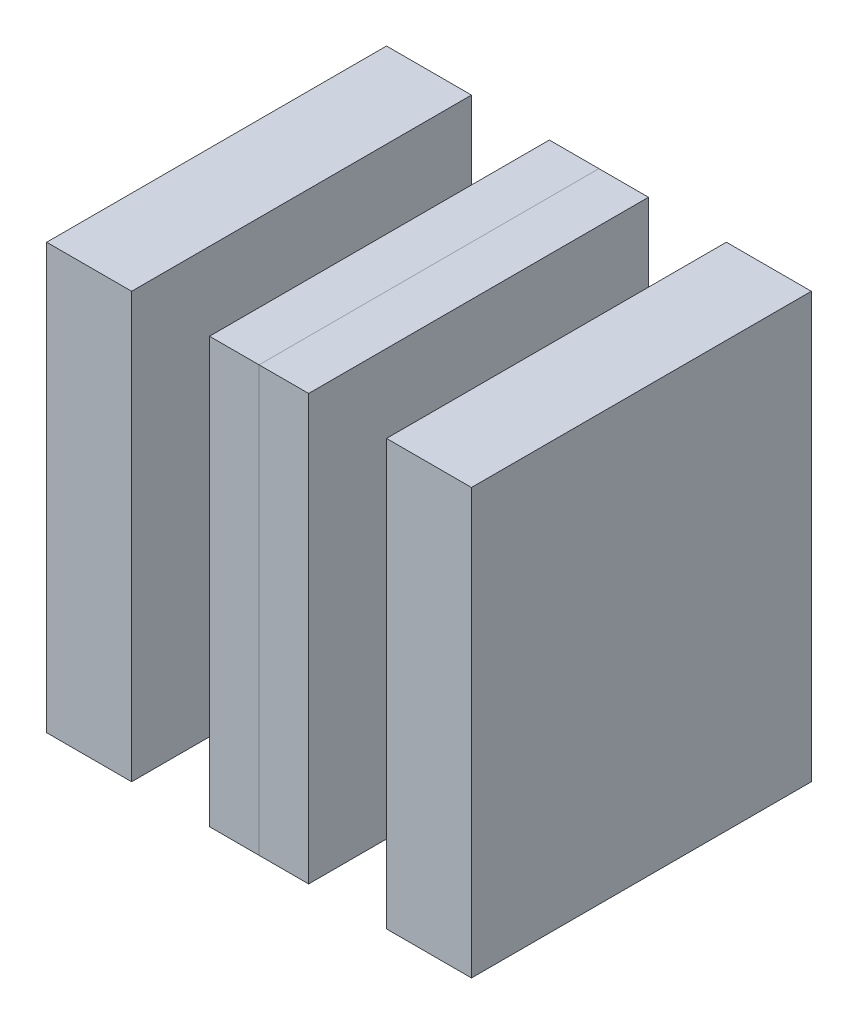
ISO-10303-21;
HEADER;
FILE_DESCRIPTION(('STEP AP214'),'2;1');
FILE_NAME('part.step','',(''),(''),'','','');
FILE_SCHEMA(('AUTOMOTIVE_DESIGN { 1 0 10303 214 1 1 1 1 }'));
ENDSEC;
DATA;
#1=APPLICATION_CONTEXT('core data for automotive mechanical design processes');
#2=APPLICATION_PROTOCOL_DEFINITION('international standard','automotive_design',2000,#1);
#3=PRODUCT_CONTEXT('',#1,'mechanical');
#4=PRODUCT('Part','Part','',(#3));
#5=PRODUCT_RELATED_PRODUCT_CATEGORY('part','',(#4));
#6=PRODUCT_DEFINITION_FORMATION('','',#4);
#7=PRODUCT_DEFINITION_CONTEXT('part definition',#1,'design');
#8=PRODUCT_DEFINITION('design','',#6,#7);
#9=PRODUCT_DEFINITION_SHAPE('','',#8);
#10=(LENGTH_UNIT() NAMED_UNIT(*) SI_UNIT(.MILLI.,.METRE.));
#11=(NAMED_UNIT(*) PLANE_ANGLE_UNIT() SI_UNIT($,.RADIAN.));
#12=(NAMED_UNIT(*) SI_UNIT($,.STERADIAN.) SOLID_ANGLE_UNIT());
#13=UNCERTAINTY_MEASURE_WITH_UNIT(LENGTH_MEASURE(1.E-05),#10,'distance_accuracy_value','');
#14=(GEOMETRIC_REPRESENTATION_CONTEXT(3) GLOBAL_UNCERTAINTY_ASSIGNED_CONTEXT((#13)) GLOBAL_UNIT_ASSIGNED_CONTEXT((#10,
#11,#12)) REPRESENTATION_CONTEXT('',''));
#15=CARTESIAN_POINT('',(0.,0.,0.));
#16=DIRECTION('',(0.,0.,1.));
#17=DIRECTION('',(1.,0.,0.));
#18=AXIS2_PLACEMENT_3D('',#15,#16,#17);
#19=CARTESIAN_POINT('',(15.,0.,12.));
#20=DIRECTION('',(-1.,0.,0.));
#21=DIRECTION('',(0.,0.,-1.));
#22=AXIS2_PLACEMENT_3D('',#19,#20,#21);
#23=PLANE('',#22);
#24=DIRECTION('',(0.,-1.,0.));
#25=VECTOR('',#24,1.);
#26=CARTESIAN_POINT('',(15.,0.,0.));
#27=LINE('',#26,#25);
#28=CARTESIAN_POINT('',(15.,15.,0.));
#29=VERTEX_POINT('',#28);
#30=CARTESIAN_POINT('',(15.,0.,0.));
#31=VERTEX_POINT('',#30);
#32=EDGE_CURVE('E106',#29,#31,#27,.T.);
#33=ORIENTED_EDGE('',*,*,#32,.F.);
#34=DIRECTION('',(0.,0.,-1.));
#35=VECTOR('',#34,1.);
#36=CARTESIAN_POINT('',(15.,15.,12.));
#37=LINE('',#36,#35);
#38=CARTESIAN_POINT('',(15.,15.,12.));
#39=VERTEX_POINT('',#38);
#40=EDGE_CURVE('E105',#39,#29,#37,.T.);
#41=ORIENTED_EDGE('',*,*,#40,.F.);
#42=DIRECTION('',(0.,-1.,0.));
#43=VECTOR('',#42,1.);
#44=CARTESIAN_POINT('',(15.,0.,12.));
#45=LINE('',#44,#43);
#46=CARTESIAN_POINT('',(15.,0.,12.));
#47=VERTEX_POINT('',#46);
#48=EDGE_CURVE('E100',#39,#47,#45,.T.);
#49=ORIENTED_EDGE('',*,*,#48,.T.);
#50=DIRECTION('',(0.,0.,-1.));
#51=VECTOR('',#50,1.);
#52=CARTESIAN_POINT('',(15.,0.,12.));
#53=LINE('',#52,#51);
#54=EDGE_CURVE('E12',#47,#31,#53,.T.);
#55=ORIENTED_EDGE('',*,*,#54,.T.);
#56=EDGE_LOOP('',(#33,#41,#49,#55));
#57=FACE_BOUND('',#56,.T.);
#58=ADVANCED_FACE('F43',(#57),#23,.F.);
#59=CARTESIAN_POINT('',(15.,0.,12.));
#60=DIRECTION('',(0.,1.,0.));
#61=DIRECTION('',(0.,0.,1.));
#62=AXIS2_PLACEMENT_3D('',#59,#60,#61);
#63=PLANE('',#62);
#64=DIRECTION('',(-1.,0.,0.));
#65=VECTOR('',#64,1.);
#66=CARTESIAN_POINT('',(15.,0.,0.));
#67=LINE('',#66,#65);
#68=CARTESIAN_POINT('',(12.,0.,0.));
#69=VERTEX_POINT('',#68);
#70=EDGE_CURVE('E108',#31,#69,#67,.T.);
#71=ORIENTED_EDGE('',*,*,#70,.F.);
#72=ORIENTED_EDGE('',*,*,#54,.F.);
#73=DIRECTION('',(-1.,0.,0.));
#74=VECTOR('',#73,1.);
#75=CARTESIAN_POINT('',(15.,0.,12.));
#76=LINE('',#75,#74);
#77=CARTESIAN_POINT('',(12.,0.,12.));
#78=VERTEX_POINT('',#77);
#79=EDGE_CURVE('E84',#47,#78,#76,.T.);
#80=ORIENTED_EDGE('',*,*,#79,.T.);
#81=DIRECTION('',(0.,0.,-1.));
#82=VECTOR('',#81,1.);
#83=CARTESIAN_POINT('',(12.,0.,12.));
#84=LINE('',#83,#82);
#85=EDGE_CURVE('E51',#78,#69,#84,.T.);
#86=ORIENTED_EDGE('',*,*,#85,.T.);
#87=EDGE_LOOP('',(#71,#72,#80,#86));
#88=FACE_BOUND('',#87,.T.);
#89=ADVANCED_FACE('F98',(#88),#63,.F.);
#90=CARTESIAN_POINT('',(12.,0.,12.));
#91=DIRECTION('',(1.,0.,0.));
#92=DIRECTION('',(0.,0.,1.));
#93=AXIS2_PLACEMENT_3D('',#90,#91,#92);
#94=PLANE('',#93);
#95=DIRECTION('',(0.,1.,0.));
#96=VECTOR('',#95,1.);
#97=CARTESIAN_POINT('',(12.,0.,0.));
#98=LINE('',#97,#96);
#99=CARTESIAN_POINT('',(12.,15.,0.));
#100=VERTEX_POINT('',#99);
#101=EDGE_CURVE('E94',#69,#100,#98,.T.);
#102=ORIENTED_EDGE('',*,*,#101,.F.);
#103=ORIENTED_EDGE('',*,*,#85,.F.);
#104=DIRECTION('',(0.,1.,0.));
#105=VECTOR('',#104,1.);
#106=CARTESIAN_POINT('',(12.,0.,12.));
#107=LINE('',#106,#105);
#108=CARTESIAN_POINT('',(12.,15.,12.));
#109=VERTEX_POINT('',#108);
#110=EDGE_CURVE('E87',#78,#109,#107,.T.);
#111=ORIENTED_EDGE('',*,*,#110,.T.);
#112=DIRECTION('',(0.,0.,-1.));
#113=VECTOR('',#112,1.);
#114=CARTESIAN_POINT('',(12.,15.,12.));
#115=LINE('',#114,#113);
#116=EDGE_CURVE('E97',#109,#100,#115,.T.);
#117=ORIENTED_EDGE('',*,*,#116,.T.);
#118=EDGE_LOOP('',(#102,#103,#111,#117));
#119=FACE_BOUND('',#118,.T.);
#120=ADVANCED_FACE('F93',(#119),#94,.F.);
#121=CARTESIAN_POINT('',(15.,15.,12.));
#122=DIRECTION('',(0.,-1.,0.));
#123=DIRECTION('',(0.,0.,-1.));
#124=AXIS2_PLACEMENT_3D('',#121,#122,#123);
#125=PLANE('',#124);
#126=DIRECTION('',(1.,0.,0.));
#127=VECTOR('',#126,1.);
#128=CARTESIAN_POINT('',(15.,15.,0.));
#129=LINE('',#128,#127);
#130=EDGE_CURVE('E73',#100,#29,#129,.T.);
#131=ORIENTED_EDGE('',*,*,#130,.F.);
#132=ORIENTED_EDGE('',*,*,#116,.F.);
#133=DIRECTION('',(1.,0.,0.));
#134=VECTOR('',#133,1.);
#135=CARTESIAN_POINT('',(15.,15.,12.));
#136=LINE('',#135,#134);
#137=EDGE_CURVE('E59',#109,#39,#136,.T.);
#138=ORIENTED_EDGE('',*,*,#137,.T.);
#139=ORIENTED_EDGE('',*,*,#40,.T.);
#140=EDGE_LOOP('',(#131,#132,#138,#139));
#141=FACE_BOUND('',#140,.T.);
#142=ADVANCED_FACE('F117',(#141),#125,.F.);
#143=CARTESIAN_POINT('',(15.,0.,12.));
#144=DIRECTION('',(0.,0.,-1.));
#145=DIRECTION('',(1.,0.,0.));
#146=AXIS2_PLACEMENT_3D('',#143,#144,#145);
#147=PLANE('',#146);
#148=ORIENTED_EDGE('',*,*,#48,.F.);
#149=ORIENTED_EDGE('',*,*,#137,.F.);
#150=ORIENTED_EDGE('',*,*,#110,.F.);
#151=ORIENTED_EDGE('',*,*,#79,.F.);
#152=EDGE_LOOP('',(#148,#149,#150,#151));
#153=FACE_BOUND('',#152,.T.);
#154=ADVANCED_FACE('F89',(#153),#147,.F.);
#155=CARTESIAN_POINT('',(15.,0.,0.));
#156=DIRECTION('',(0.,0.,-1.));
#157=DIRECTION('',(1.,0.,0.));
#158=AXIS2_PLACEMENT_3D('',#155,#156,#157);
#159=PLANE('',#158);
#160=ORIENTED_EDGE('',*,*,#32,.T.);
#161=ORIENTED_EDGE('',*,*,#70,.T.);
#162=ORIENTED_EDGE('',*,*,#101,.T.);
#163=ORIENTED_EDGE('',*,*,#130,.T.);
#164=EDGE_LOOP('',(#160,#161,#162,#163));
#165=FACE_BOUND('',#164,.T.);
#166=ADVANCED_FACE('F113',(#165),#159,.T.);
#167=CLOSED_SHELL('',(#58,#89,#120,#142,#154,#166));
#168=MANIFOLD_SOLID_BREP('B2',#167);
#169=CARTESIAN_POINT('',(9.25,15.,12.));
#170=DIRECTION('',(-1.,0.,0.));
#171=DIRECTION('',(0.,1.,0.));
#172=AXIS2_PLACEMENT_3D('',#169,#170,#171);
#173=PLANE('',#172);
#174=DIRECTION('',(0.,-1.,0.));
#175=VECTOR('',#174,1.);
#176=CARTESIAN_POINT('',(9.25,15.,0.));
#177=LINE('',#176,#175);
#178=CARTESIAN_POINT('',(9.25,15.,0.));
#179=VERTEX_POINT('',#178);
#180=CARTESIAN_POINT('',(9.25,0.,0.));
#181=VERTEX_POINT('',#180);
#182=EDGE_CURVE('E239',#179,#181,#177,.T.);
#183=ORIENTED_EDGE('',*,*,#182,.F.);
#184=DIRECTION('',(0.,0.,-1.));
#185=VECTOR('',#184,1.);
#186=CARTESIAN_POINT('',(9.25,15.,12.));
#187=LINE('',#186,#185);
#188=CARTESIAN_POINT('',(9.25,15.,12.));
#189=VERTEX_POINT('',#188);
#190=EDGE_CURVE('E238',#189,#179,#187,.T.);
#191=ORIENTED_EDGE('',*,*,#190,.F.);
#192=DIRECTION('',(0.,-1.,0.));
#193=VECTOR('',#192,1.);
#194=CARTESIAN_POINT('',(9.25,15.,12.));
#195=LINE('',#194,#193);
#196=CARTESIAN_POINT('',(9.25,0.,12.));
#197=VERTEX_POINT('',#196);
#198=EDGE_CURVE('E233',#189,#197,#195,.T.);
#199=ORIENTED_EDGE('',*,*,#198,.T.);
#200=DIRECTION('',(0.,0.,-1.));
#201=VECTOR('',#200,1.);
#202=CARTESIAN_POINT('',(9.25,0.,12.));
#203=LINE('',#202,#201);
#204=EDGE_CURVE('E41',#197,#181,#203,.T.);
#205=ORIENTED_EDGE('',*,*,#204,.T.);
#206=EDGE_LOOP('',(#183,#191,#199,#205));
#207=FACE_BOUND('',#206,.T.);
#208=ADVANCED_FACE('F176',(#207),#173,.F.);
#209=CARTESIAN_POINT('',(9.25,0.,12.));
#210=DIRECTION('',(0.,1.,0.));
#211=DIRECTION('',(0.,0.,1.));
#212=AXIS2_PLACEMENT_3D('',#209,#210,#211);
#213=PLANE('',#212);
#214=DIRECTION('',(-1.,0.,0.));
#215=VECTOR('',#214,1.);
#216=CARTESIAN_POINT('',(9.25,0.,0.));
#217=LINE('',#216,#215);
#218=CARTESIAN_POINT('',(7.5,0.,0.));
#219=VERTEX_POINT('',#218);
#220=EDGE_CURVE('E241',#181,#219,#217,.T.);
#221=ORIENTED_EDGE('',*,*,#220,.F.);
#222=ORIENTED_EDGE('',*,*,#204,.F.);
#223=DIRECTION('',(-1.,0.,0.));
#224=VECTOR('',#223,1.);
#225=CARTESIAN_POINT('',(9.25,0.,12.));
#226=LINE('',#225,#224);
#227=CARTESIAN_POINT('',(7.5,0.,12.));
#228=VERTEX_POINT('',#227);
#229=EDGE_CURVE('E217',#197,#228,#226,.T.);
#230=ORIENTED_EDGE('',*,*,#229,.T.);
#231=DIRECTION('',(0.,0.,-1.));
#232=VECTOR('',#231,1.);
#233=CARTESIAN_POINT('',(7.5,0.,12.));
#234=LINE('',#233,#232);
#235=EDGE_CURVE('E184',#228,#219,#234,.T.);
#236=ORIENTED_EDGE('',*,*,#235,.T.);
#237=EDGE_LOOP('',(#221,#222,#230,#236));
#238=FACE_BOUND('',#237,.T.);
#239=ADVANCED_FACE('F231',(#238),#213,.F.);
#240=CARTESIAN_POINT('',(7.5,15.,12.));
#241=DIRECTION('',(1.,0.,0.));
#242=DIRECTION('',(0.,-1.,0.));
#243=AXIS2_PLACEMENT_3D('',#240,#241,#242);
#244=PLANE('',#243);
#245=DIRECTION('',(0.,1.,0.));
#246=VECTOR('',#245,1.);
#247=CARTESIAN_POINT('',(7.5,15.,0.));
#248=LINE('',#247,#246);
#249=CARTESIAN_POINT('',(7.5,15.,0.));
#250=VERTEX_POINT('',#249);
#251=EDGE_CURVE('E227',#219,#250,#248,.T.);
#252=ORIENTED_EDGE('',*,*,#251,.F.);
#253=ORIENTED_EDGE('',*,*,#235,.F.);
#254=DIRECTION('',(0.,1.,0.));
#255=VECTOR('',#254,1.);
#256=CARTESIAN_POINT('',(7.5,15.,12.));
#257=LINE('',#256,#255);
#258=CARTESIAN_POINT('',(7.5,15.,12.));
#259=VERTEX_POINT('',#258);
#260=EDGE_CURVE('E220',#228,#259,#257,.T.);
#261=ORIENTED_EDGE('',*,*,#260,.T.);
#262=DIRECTION('',(0.,0.,-1.));
#263=VECTOR('',#262,1.);
#264=CARTESIAN_POINT('',(7.5,15.,12.));
#265=LINE('',#264,#263);
#266=EDGE_CURVE('E230',#259,#250,#265,.T.);
#267=ORIENTED_EDGE('',*,*,#266,.T.);
#268=EDGE_LOOP('',(#252,#253,#261,#267));
#269=FACE_BOUND('',#268,.T.);
#270=ADVANCED_FACE('F226',(#269),#244,.F.);
#271=CARTESIAN_POINT('',(9.25,15.,12.));
#272=DIRECTION('',(0.,-1.,0.));
#273=DIRECTION('',(0.,0.,-1.));
#274=AXIS2_PLACEMENT_3D('',#271,#272,#273);
#275=PLANE('',#274);
#276=DIRECTION('',(1.,0.,0.));
#277=VECTOR('',#276,1.);
#278=CARTESIAN_POINT('',(9.25,15.,0.));
#279=LINE('',#278,#277);
#280=EDGE_CURVE('E206',#250,#179,#279,.T.);
#281=ORIENTED_EDGE('',*,*,#280,.F.);
#282=ORIENTED_EDGE('',*,*,#266,.F.);
#283=DIRECTION('',(1.,0.,0.));
#284=VECTOR('',#283,1.);
#285=CARTESIAN_POINT('',(9.25,15.,12.));
#286=LINE('',#285,#284);
#287=EDGE_CURVE('E192',#259,#189,#286,.T.);
#288=ORIENTED_EDGE('',*,*,#287,.T.);
#289=ORIENTED_EDGE('',*,*,#190,.T.);
#290=EDGE_LOOP('',(#281,#282,#288,#289));
#291=FACE_BOUND('',#290,.T.);
#292=ADVANCED_FACE('F250',(#291),#275,.F.);
#293=CARTESIAN_POINT('',(15.,0.,12.));
#294=DIRECTION('',(0.,0.,1.));
#295=DIRECTION('',(-1.,0.,0.));
#296=AXIS2_PLACEMENT_3D('',#293,#294,#295);
#297=PLANE('',#296);
#298=ORIENTED_EDGE('',*,*,#198,.F.);
#299=ORIENTED_EDGE('',*,*,#287,.F.);
#300=ORIENTED_EDGE('',*,*,#260,.F.);
#301=ORIENTED_EDGE('',*,*,#229,.F.);
#302=EDGE_LOOP('',(#298,#299,#300,#301));
#303=FACE_BOUND('',#302,.T.);
#304=ADVANCED_FACE('F222',(#303),#297,.T.);
#305=CARTESIAN_POINT('',(15.,0.,0.));
#306=DIRECTION('',(0.,0.,1.));
#307=DIRECTION('',(-1.,0.,0.));
#308=AXIS2_PLACEMENT_3D('',#305,#306,#307);
#309=PLANE('',#308);
#310=ORIENTED_EDGE('',*,*,#182,.T.);
#311=ORIENTED_EDGE('',*,*,#220,.T.);
#312=ORIENTED_EDGE('',*,*,#251,.T.);
#313=ORIENTED_EDGE('',*,*,#280,.T.);
#314=EDGE_LOOP('',(#310,#311,#312,#313));
#315=FACE_BOUND('',#314,.T.);
#316=ADVANCED_FACE('F246',(#315),#309,.F.);
#317=CLOSED_SHELL('',(#208,#239,#270,#292,#304,#316));
#318=MANIFOLD_SOLID_BREP('B6',#317);
#319=CARTESIAN_POINT('',(5.75,15.,12.));
#320=DIRECTION('',(1.,0.,0.));
#321=DIRECTION('',(0.,1.,0.));
#322=AXIS2_PLACEMENT_3D('',#319,#320,#321);
#323=PLANE('',#322);
#324=DIRECTION('',(0.,-1.,0.));
#325=VECTOR('',#324,1.);
#326=CARTESIAN_POINT('',(5.75,15.,0.));
#327=LINE('',#326,#325);
#328=CARTESIAN_POINT('',(5.75,15.,0.));
#329=VERTEX_POINT('',#328);
#330=CARTESIAN_POINT('',(5.75,0.,0.));
#331=VERTEX_POINT('',#330);
#332=EDGE_CURVE('E371',#329,#331,#327,.T.);
#333=ORIENTED_EDGE('',*,*,#332,.T.);
#334=DIRECTION('',(0.,0.,-1.));
#335=VECTOR('',#334,1.);
#336=CARTESIAN_POINT('',(5.75,0.,12.));
#337=LINE('',#336,#335);
#338=CARTESIAN_POINT('',(5.75,0.,12.));
#339=VERTEX_POINT('',#338);
#340=EDGE_CURVE('E174',#339,#331,#337,.T.);
#341=ORIENTED_EDGE('',*,*,#340,.F.);
#342=DIRECTION('',(0.,-1.,0.));
#343=VECTOR('',#342,1.);
#344=CARTESIAN_POINT('',(5.75,15.,12.));
#345=LINE('',#344,#343);
#346=CARTESIAN_POINT('',(5.75,15.,12.));
#347=VERTEX_POINT('',#346);
#348=EDGE_CURVE('E359',#347,#339,#345,.T.);
#349=ORIENTED_EDGE('',*,*,#348,.F.);
#350=DIRECTION('',(0.,0.,-1.));
#351=VECTOR('',#350,1.);
#352=CARTESIAN_POINT('',(5.75,15.,12.));
#353=LINE('',#352,#351);
#354=EDGE_CURVE('E367',#347,#329,#353,.T.);
#355=ORIENTED_EDGE('',*,*,#354,.T.);
#356=EDGE_LOOP('',(#333,#341,#349,#355));
#357=FACE_BOUND('',#356,.T.);
#358=ADVANCED_FACE('F308',(#357),#323,.F.);
#359=CARTESIAN_POINT('',(5.75,0.,12.));
#360=DIRECTION('',(0.,1.,0.));
#361=DIRECTION('',(0.,0.,1.));
#362=AXIS2_PLACEMENT_3D('',#359,#360,#361);
#363=PLANE('',#362);
#364=DIRECTION('',(1.,0.,0.));
#365=VECTOR('',#364,1.);
#366=CARTESIAN_POINT('',(5.75,0.,0.));
#367=LINE('',#366,#365);
#368=CARTESIAN_POINT('',(7.5,0.,0.));
#369=VERTEX_POINT('',#368);
#370=EDGE_CURVE('E363',#331,#369,#367,.T.);
#371=ORIENTED_EDGE('',*,*,#370,.T.);
#372=DIRECTION('',(0.,0.,-1.));
#373=VECTOR('',#372,1.);
#374=CARTESIAN_POINT('',(7.5,0.,12.));
#375=LINE('',#374,#373);
#376=CARTESIAN_POINT('',(7.5,0.,12.));
#377=VERTEX_POINT('',#376);
#378=EDGE_CURVE('E316',#377,#369,#375,.T.);
#379=ORIENTED_EDGE('',*,*,#378,.F.);
#380=DIRECTION('',(1.,0.,0.));
#381=VECTOR('',#380,1.);
#382=CARTESIAN_POINT('',(5.75,0.,12.));
#383=LINE('',#382,#381);
#384=EDGE_CURVE('E354',#339,#377,#383,.T.);
#385=ORIENTED_EDGE('',*,*,#384,.F.);
#386=ORIENTED_EDGE('',*,*,#340,.T.);
#387=EDGE_LOOP('',(#371,#379,#385,#386));
#388=FACE_BOUND('',#387,.T.);
#389=ADVANCED_FACE('F362',(#388),#363,.F.);
#390=CARTESIAN_POINT('',(7.5,15.,12.));
#391=DIRECTION('',(-1.,0.,0.));
#392=DIRECTION('',(0.,-1.,0.));
#393=AXIS2_PLACEMENT_3D('',#390,#391,#392);
#394=PLANE('',#393);
#395=DIRECTION('',(0.,1.,0.));
#396=VECTOR('',#395,1.);
#397=CARTESIAN_POINT('',(7.5,15.,0.));
#398=LINE('',#397,#396);
#399=CARTESIAN_POINT('',(7.5,15.,0.));
#400=VERTEX_POINT('',#399);
#401=EDGE_CURVE('E341',#369,#400,#398,.T.);
#402=ORIENTED_EDGE('',*,*,#401,.T.);
#403=DIRECTION('',(0.,0.,-1.));
#404=VECTOR('',#403,1.);
#405=CARTESIAN_POINT('',(7.5,15.,12.));
#406=LINE('',#405,#404);
#407=CARTESIAN_POINT('',(7.5,15.,12.));
#408=VERTEX_POINT('',#407);
#409=EDGE_CURVE('E364',#408,#400,#406,.T.);
#410=ORIENTED_EDGE('',*,*,#409,.F.);
#411=DIRECTION('',(0.,1.,0.));
#412=VECTOR('',#411,1.);
#413=CARTESIAN_POINT('',(7.5,15.,12.));
#414=LINE('',#413,#412);
#415=EDGE_CURVE('E357',#377,#408,#414,.T.);
#416=ORIENTED_EDGE('',*,*,#415,.F.);
#417=ORIENTED_EDGE('',*,*,#378,.T.);
#418=EDGE_LOOP('',(#402,#410,#416,#417));
#419=FACE_BOUND('',#418,.T.);
#420=ADVANCED_FACE('F365',(#419),#394,.F.);
#421=CARTESIAN_POINT('',(5.75,15.,12.));
#422=DIRECTION('',(0.,-1.,0.));
#423=DIRECTION('',(0.,0.,-1.));
#424=AXIS2_PLACEMENT_3D('',#421,#422,#423);
#425=PLANE('',#424);
#426=DIRECTION('',(-1.,0.,0.));
#427=VECTOR('',#426,1.);
#428=CARTESIAN_POINT('',(5.75,15.,0.));
#429=LINE('',#428,#427);
#430=EDGE_CURVE('E347',#400,#329,#429,.T.);
#431=ORIENTED_EDGE('',*,*,#430,.T.);
#432=ORIENTED_EDGE('',*,*,#354,.F.);
#433=DIRECTION('',(-1.,0.,0.));
#434=VECTOR('',#433,1.);
#435=CARTESIAN_POINT('',(5.75,15.,12.));
#436=LINE('',#435,#434);
#437=EDGE_CURVE('E324',#408,#347,#436,.T.);
#438=ORIENTED_EDGE('',*,*,#437,.F.);
#439=ORIENTED_EDGE('',*,*,#409,.T.);
#440=EDGE_LOOP('',(#431,#432,#438,#439));
#441=FACE_BOUND('',#440,.T.);
#442=ADVANCED_FACE('F378',(#441),#425,.F.);
#443=CARTESIAN_POINT('',(0.,0.,12.));
#444=DIRECTION('',(0.,0.,1.));
#445=DIRECTION('',(1.,0.,0.));
#446=AXIS2_PLACEMENT_3D('',#443,#444,#445);
#447=PLANE('',#446);
#448=ORIENTED_EDGE('',*,*,#348,.T.);
#449=ORIENTED_EDGE('',*,*,#384,.T.);
#450=ORIENTED_EDGE('',*,*,#415,.T.);
#451=ORIENTED_EDGE('',*,*,#437,.T.);
#452=EDGE_LOOP('',(#448,#449,#450,#451));
#453=FACE_BOUND('',#452,.T.);
#454=ADVANCED_FACE('F355',(#453),#447,.T.);
#455=CARTESIAN_POINT('',(0.,0.,0.));
#456=DIRECTION('',(0.,0.,1.));
#457=DIRECTION('',(1.,0.,0.));
#458=AXIS2_PLACEMENT_3D('',#455,#456,#457);
#459=PLANE('',#458);
#460=ORIENTED_EDGE('',*,*,#332,.F.);
#461=ORIENTED_EDGE('',*,*,#430,.F.);
#462=ORIENTED_EDGE('',*,*,#401,.F.);
#463=ORIENTED_EDGE('',*,*,#370,.F.);
#464=EDGE_LOOP('',(#460,#461,#462,#463));
#465=FACE_BOUND('',#464,.T.);
#466=ADVANCED_FACE('F381',(#465),#459,.F.);
#467=CLOSED_SHELL('',(#358,#389,#420,#442,#454,#466));
#468=MANIFOLD_SOLID_BREP('B35',#467);
#469=CARTESIAN_POINT('',(0.,0.,12.));
#470=DIRECTION('',(1.,0.,0.));
#471=DIRECTION('',(0.,0.,-1.));
#472=AXIS2_PLACEMENT_3D('',#469,#470,#471);
#473=PLANE('',#472);
#474=DIRECTION('',(0.,-1.,0.));
#475=VECTOR('',#474,1.);
#476=CARTESIAN_POINT('',(0.,0.,0.));
#477=LINE('',#476,#475);
#478=CARTESIAN_POINT('',(0.,15.,0.));
#479=VERTEX_POINT('',#478);
#480=CARTESIAN_POINT('',(0.,0.,0.));
#481=VERTEX_POINT('',#480);
#482=EDGE_CURVE('E494',#479,#481,#477,.T.);
#483=ORIENTED_EDGE('',*,*,#482,.T.);
#484=DIRECTION('',(0.,0.,-1.));
#485=VECTOR('',#484,1.);
#486=CARTESIAN_POINT('',(0.,0.,12.));
#487=LINE('',#486,#485);
#488=CARTESIAN_POINT('',(0.,0.,12.));
#489=VERTEX_POINT('',#488);
#490=EDGE_CURVE('E306',#489,#481,#487,.T.);
#491=ORIENTED_EDGE('',*,*,#490,.F.);
#492=DIRECTION('',(0.,-1.,0.));
#493=VECTOR('',#492,1.);
#494=CARTESIAN_POINT('',(0.,0.,12.));
#495=LINE('',#494,#493);
#496=CARTESIAN_POINT('',(0.,15.,12.));
#497=VERTEX_POINT('',#496);
#498=EDGE_CURVE('E482',#497,#489,#495,.T.);
#499=ORIENTED_EDGE('',*,*,#498,.F.);
#500=DIRECTION('',(0.,0.,-1.));
#501=VECTOR('',#500,1.);
#502=CARTESIAN_POINT('',(0.,15.,12.));
#503=LINE('',#502,#501);
#504=EDGE_CURVE('E490',#497,#479,#503,.T.);
#505=ORIENTED_EDGE('',*,*,#504,.T.);
#506=EDGE_LOOP('',(#483,#491,#499,#505));
#507=FACE_BOUND('',#506,.T.);
#508=ADVANCED_FACE('F431',(#507),#473,.F.);
#509=CARTESIAN_POINT('',(0.,0.,12.));
#510=DIRECTION('',(0.,1.,0.));
#511=DIRECTION('',(0.,0.,1.));
#512=AXIS2_PLACEMENT_3D('',#509,#510,#511);
#513=PLANE('',#512);
#514=DIRECTION('',(1.,0.,0.));
#515=VECTOR('',#514,1.);
#516=CARTESIAN_POINT('',(0.,0.,0.));
#517=LINE('',#516,#515);
#518=CARTESIAN_POINT('',(3.,0.,0.));
#519=VERTEX_POINT('',#518);
#520=EDGE_CURVE('E486',#481,#519,#517,.T.);
#521=ORIENTED_EDGE('',*,*,#520,.T.);
#522=DIRECTION('',(0.,0.,-1.));
#523=VECTOR('',#522,1.);
#524=CARTESIAN_POINT('',(3.,0.,12.));
#525=LINE('',#524,#523);
#526=CARTESIAN_POINT('',(3.,0.,12.));
#527=VERTEX_POINT('',#526);
#528=EDGE_CURVE('E439',#527,#519,#525,.T.);
#529=ORIENTED_EDGE('',*,*,#528,.F.);
#530=DIRECTION('',(1.,0.,0.));
#531=VECTOR('',#530,1.);
#532=CARTESIAN_POINT('',(0.,0.,12.));
#533=LINE('',#532,#531);
#534=EDGE_CURVE('E477',#489,#527,#533,.T.);
#535=ORIENTED_EDGE('',*,*,#534,.F.);
#536=ORIENTED_EDGE('',*,*,#490,.T.);
#537=EDGE_LOOP('',(#521,#529,#535,#536));
#538=FACE_BOUND('',#537,.T.);
#539=ADVANCED_FACE('F485',(#538),#513,.F.);
#540=CARTESIAN_POINT('',(3.,0.,12.));
#541=DIRECTION('',(-1.,0.,0.));
#542=DIRECTION('',(0.,0.,1.));
#543=AXIS2_PLACEMENT_3D('',#540,#541,#542);
#544=PLANE('',#543);
#545=DIRECTION('',(0.,1.,0.));
#546=VECTOR('',#545,1.);
#547=CARTESIAN_POINT('',(3.,0.,0.));
#548=LINE('',#547,#546);
#549=CARTESIAN_POINT('',(3.,15.,0.));
#550=VERTEX_POINT('',#549);
#551=EDGE_CURVE('E464',#519,#550,#548,.T.);
#552=ORIENTED_EDGE('',*,*,#551,.T.);
#553=DIRECTION('',(0.,0.,-1.));
#554=VECTOR('',#553,1.);
#555=CARTESIAN_POINT('',(3.,15.,12.));
#556=LINE('',#555,#554);
#557=CARTESIAN_POINT('',(3.,15.,12.));
#558=VERTEX_POINT('',#557);
#559=EDGE_CURVE('E487',#558,#550,#556,.T.);
#560=ORIENTED_EDGE('',*,*,#559,.F.);
#561=DIRECTION('',(0.,1.,0.));
#562=VECTOR('',#561,1.);
#563=CARTESIAN_POINT('',(3.,0.,12.));
#564=LINE('',#563,#562);
#565=EDGE_CURVE('E480',#527,#558,#564,.T.);
#566=ORIENTED_EDGE('',*,*,#565,.F.);
#567=ORIENTED_EDGE('',*,*,#528,.T.);
#568=EDGE_LOOP('',(#552,#560,#566,#567));
#569=FACE_BOUND('',#568,.T.);
#570=ADVANCED_FACE('F488',(#569),#544,.F.);
#571=CARTESIAN_POINT('',(0.,15.,12.));
#572=DIRECTION('',(0.,-1.,0.));
#573=DIRECTION('',(0.,0.,-1.));
#574=AXIS2_PLACEMENT_3D('',#571,#572,#573);
#575=PLANE('',#574);
#576=DIRECTION('',(-1.,0.,0.));
#577=VECTOR('',#576,1.);
#578=CARTESIAN_POINT('',(0.,15.,0.));
#579=LINE('',#578,#577);
#580=EDGE_CURVE('E470',#550,#479,#579,.T.);
#581=ORIENTED_EDGE('',*,*,#580,.T.);
#582=ORIENTED_EDGE('',*,*,#504,.F.);
#583=DIRECTION('',(-1.,0.,0.));
#584=VECTOR('',#583,1.);
#585=CARTESIAN_POINT('',(0.,15.,12.));
#586=LINE('',#585,#584);
#587=EDGE_CURVE('E447',#558,#497,#586,.T.);
#588=ORIENTED_EDGE('',*,*,#587,.F.);
#589=ORIENTED_EDGE('',*,*,#559,.T.);
#590=EDGE_LOOP('',(#581,#582,#588,#589));
#591=FACE_BOUND('',#590,.T.);
#592=ADVANCED_FACE('F501',(#591),#575,.F.);
#593=CARTESIAN_POINT('',(0.,0.,12.));
#594=DIRECTION('',(0.,0.,-1.));
#595=DIRECTION('',(-1.,0.,0.));
#596=AXIS2_PLACEMENT_3D('',#593,#594,#595);
#597=PLANE('',#596);
#598=ORIENTED_EDGE('',*,*,#498,.T.);
#599=ORIENTED_EDGE('',*,*,#534,.T.);
#600=ORIENTED_EDGE('',*,*,#565,.T.);
#601=ORIENTED_EDGE('',*,*,#587,.T.);
#602=EDGE_LOOP('',(#598,#599,#600,#601));
#603=FACE_BOUND('',#602,.T.);
#604=ADVANCED_FACE('F478',(#603),#597,.F.);
#605=CARTESIAN_POINT('',(0.,0.,0.));
#606=DIRECTION('',(0.,0.,-1.));
#607=DIRECTION('',(-1.,0.,0.));
#608=AXIS2_PLACEMENT_3D('',#605,#606,#607);
#609=PLANE('',#608);
#610=ORIENTED_EDGE('',*,*,#482,.F.);
#611=ORIENTED_EDGE('',*,*,#580,.F.);
#612=ORIENTED_EDGE('',*,*,#551,.F.);
#613=ORIENTED_EDGE('',*,*,#520,.F.);
#614=EDGE_LOOP('',(#610,#611,#612,#613));
#615=FACE_BOUND('',#614,.T.);
#616=ADVANCED_FACE('F504',(#615),#609,.T.);
#617=CLOSED_SHELL('',(#508,#539,#570,#592,#604,#616));
#618=MANIFOLD_SOLID_BREP('B168',#617);
#619=ADVANCED_BREP_SHAPE_REPRESENTATION('',(#18,#168,#318,#468,#618),#14);
#620=SHAPE_DEFINITION_REPRESENTATION(#9,#619);
ENDSEC;
END-ISO-10303-21;
